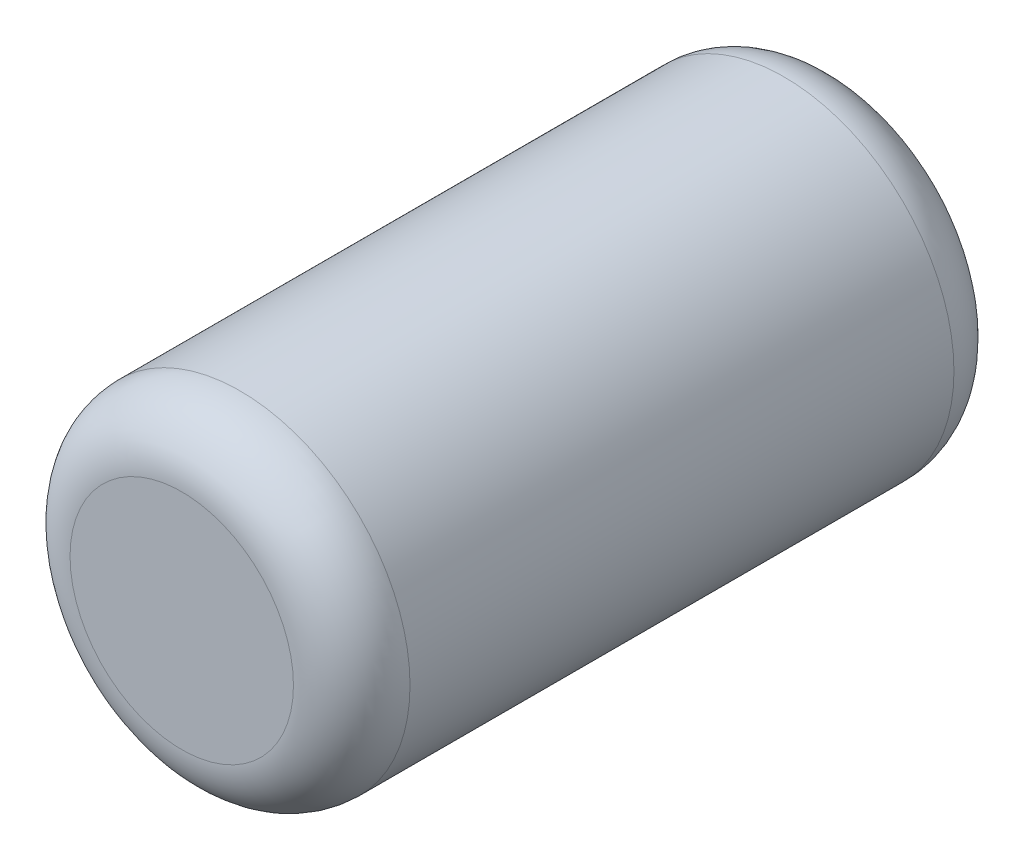
ISO-10303-21;
HEADER;
FILE_DESCRIPTION(('STEP AP214'),'2;1');
FILE_NAME('part.step','',(''),(''),'','','');
FILE_SCHEMA(('AUTOMOTIVE_DESIGN { 1 0 10303 214 1 1 1 1 }'));
ENDSEC;
DATA;
#1=APPLICATION_CONTEXT('core data for automotive mechanical design processes');
#2=APPLICATION_PROTOCOL_DEFINITION('international standard','automotive_design',2000,#1);
#3=PRODUCT_CONTEXT('',#1,'mechanical');
#4=PRODUCT('Part','Part','',(#3));
#5=PRODUCT_RELATED_PRODUCT_CATEGORY('part','',(#4));
#6=PRODUCT_DEFINITION_FORMATION('','',#4);
#7=PRODUCT_DEFINITION_CONTEXT('part definition',#1,'design');
#8=PRODUCT_DEFINITION('design','',#6,#7);
#9=PRODUCT_DEFINITION_SHAPE('','',#8);
#10=(LENGTH_UNIT() NAMED_UNIT(*) SI_UNIT(.MILLI.,.METRE.));
#11=(NAMED_UNIT(*) PLANE_ANGLE_UNIT() SI_UNIT($,.RADIAN.));
#12=(NAMED_UNIT(*) SI_UNIT($,.STERADIAN.) SOLID_ANGLE_UNIT());
#13=UNCERTAINTY_MEASURE_WITH_UNIT(LENGTH_MEASURE(1.E-05),#10,'distance_accuracy_value','');
#14=(GEOMETRIC_REPRESENTATION_CONTEXT(3) GLOBAL_UNCERTAINTY_ASSIGNED_CONTEXT((#13)) GLOBAL_UNIT_ASSIGNED_CONTEXT((#10,
#11,#12)) REPRESENTATION_CONTEXT('',''));
#15=CARTESIAN_POINT('',(0.,0.,0.));
#16=DIRECTION('',(0.,0.,1.));
#17=DIRECTION('',(1.,0.,0.));
#18=AXIS2_PLACEMENT_3D('',#15,#16,#17);
#19=CARTESIAN_POINT('',(0.,0.,34.));
#20=DIRECTION('',(0.,0.,-1.));
#21=DIRECTION('',(-1.,0.,0.));
#22=AXIS2_PLACEMENT_3D('',#19,#20,#21);
#23=CYLINDRICAL_SURFACE('',#22,8.75);
#24=CARTESIAN_POINT('',(0.,0.,31.));
#25=DIRECTION('',(0.,0.,1.));
#26=DIRECTION('',(1.,0.,0.));
#27=AXIS2_PLACEMENT_3D('',#24,#25,#26);
#28=CIRCLE('',#27,8.75);
#29=CARTESIAN_POINT('',(8.75,0.,31.));
#30=VERTEX_POINT('',#29);
#31=EDGE_CURVE('E42',#30,#30,#28,.F.);
#32=ORIENTED_EDGE('',*,*,#31,.T.);
#33=EDGE_LOOP('',(#32));
#34=FACE_BOUND('',#33,.T.);
#35=CARTESIAN_POINT('',(0.,0.,3.));
#36=DIRECTION('',(0.,0.,1.));
#37=DIRECTION('',(1.,0.,0.));
#38=AXIS2_PLACEMENT_3D('',#35,#36,#37);
#39=CIRCLE('',#38,8.75);
#40=CARTESIAN_POINT('',(8.75,0.,3.));
#41=VERTEX_POINT('',#40);
#42=EDGE_CURVE('E46',#41,#41,#39,.T.);
#43=ORIENTED_EDGE('',*,*,#42,.T.);
#44=EDGE_LOOP('',(#43));
#45=FACE_BOUND('',#44,.T.);
#46=ADVANCED_FACE('F35',(#34,#45),#23,.T.);
#47=CARTESIAN_POINT('',(0.,0.,34.));
#48=DIRECTION('',(0.,0.,1.));
#49=DIRECTION('',(1.,0.,0.));
#50=AXIS2_PLACEMENT_3D('',#47,#48,#49);
#51=PLANE('',#50);
#52=CARTESIAN_POINT('',(0.,0.,34.));
#53=DIRECTION('',(0.,0.,1.));
#54=DIRECTION('',(1.,0.,0.));
#55=AXIS2_PLACEMENT_3D('',#52,#53,#54);
#56=CIRCLE('',#55,5.75);
#57=CARTESIAN_POINT('',(5.75,0.,34.));
#58=VERTEX_POINT('',#57);
#59=EDGE_CURVE('E50',#58,#58,#56,.T.);
#60=ORIENTED_EDGE('',*,*,#59,.T.);
#61=EDGE_LOOP('',(#60));
#62=FACE_BOUND('',#61,.T.);
#63=ADVANCED_FACE('F56',(#62),#51,.T.);
#64=CARTESIAN_POINT('',(0.,0.,0.));
#65=DIRECTION('',(0.,0.,1.));
#66=DIRECTION('',(1.,0.,0.));
#67=AXIS2_PLACEMENT_3D('',#64,#65,#66);
#68=PLANE('',#67);
#69=CARTESIAN_POINT('',(0.,0.,0.));
#70=DIRECTION('',(0.,0.,1.));
#71=DIRECTION('',(1.,0.,0.));
#72=AXIS2_PLACEMENT_3D('',#69,#70,#71);
#73=CIRCLE('',#72,5.75);
#74=CARTESIAN_POINT('',(5.75,0.,0.));
#75=VERTEX_POINT('',#74);
#76=EDGE_CURVE('E10',#75,#75,#73,.F.);
#77=ORIENTED_EDGE('',*,*,#76,.T.);
#78=EDGE_LOOP('',(#77));
#79=FACE_BOUND('',#78,.T.);
#80=ADVANCED_FACE('F60',(#79),#68,.F.);
#81=CARTESIAN_POINT('',(0.,0.,31.));
#82=DIRECTION('',(0.,0.,1.));
#83=DIRECTION('',(1.,0.,0.));
#84=AXIS2_PLACEMENT_3D('',#81,#82,#83);
#85=TOROIDAL_SURFACE('',#84,5.75,3.);
#86=ORIENTED_EDGE('',*,*,#31,.F.);
#87=EDGE_LOOP('',(#86));
#88=FACE_BOUND('',#87,.T.);
#89=ORIENTED_EDGE('',*,*,#59,.F.);
#90=EDGE_LOOP('',(#89));
#91=FACE_BOUND('',#90,.T.);
#92=ADVANCED_FACE('F58',(#88,#91),#85,.T.);
#93=CARTESIAN_POINT('',(0.,0.,3.));
#94=DIRECTION('',(0.,0.,1.));
#95=DIRECTION('',(1.,0.,0.));
#96=AXIS2_PLACEMENT_3D('',#93,#94,#95);
#97=TOROIDAL_SURFACE('',#96,5.75,3.);
#98=ORIENTED_EDGE('',*,*,#76,.F.);
#99=EDGE_LOOP('',(#98));
#100=FACE_BOUND('',#99,.T.);
#101=ORIENTED_EDGE('',*,*,#42,.F.);
#102=EDGE_LOOP('',(#101));
#103=FACE_BOUND('',#102,.T.);
#104=ADVANCED_FACE('F37',(#100,#103),#97,.T.);
#105=CLOSED_SHELL('',(#46,#63,#80,#92,#104));
#106=MANIFOLD_SOLID_BREP('B2',#105);
#107=ADVANCED_BREP_SHAPE_REPRESENTATION('',(#18,#106),#14);
#108=SHAPE_DEFINITION_REPRESENTATION(#9,#107);
ENDSEC;
END-ISO-10303-21;
